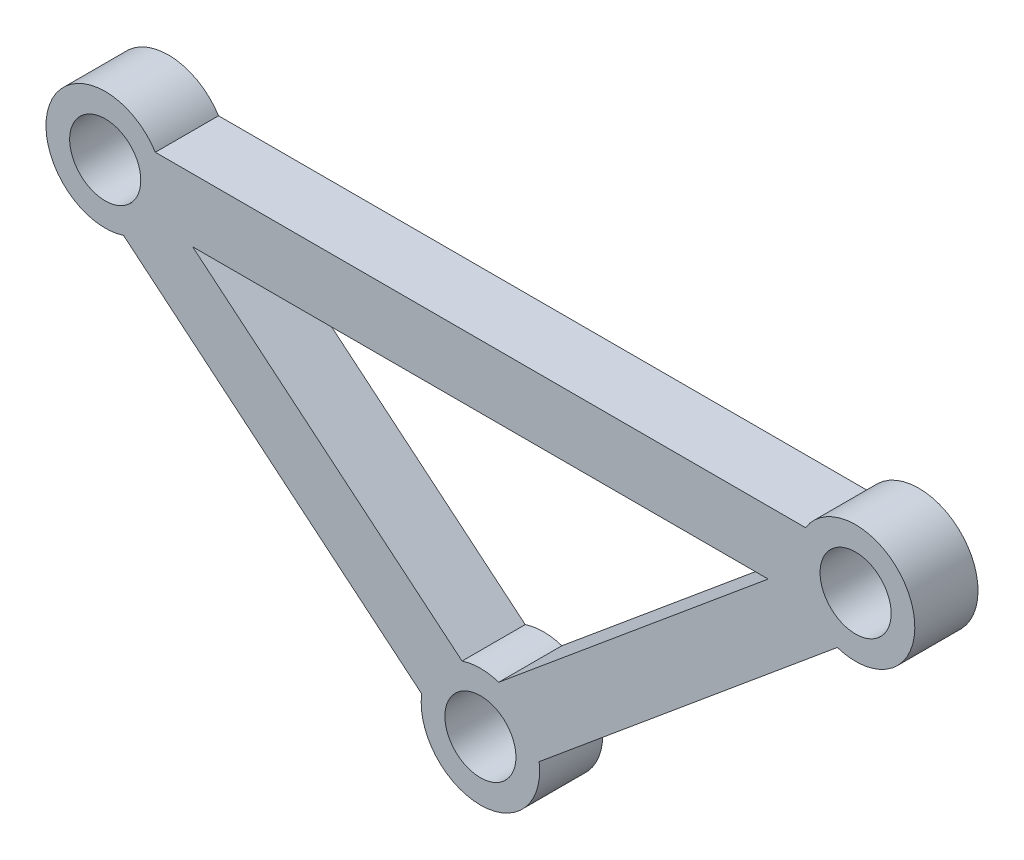
ISO-10303-21;
HEADER;
FILE_DESCRIPTION(('STEP AP214'),'2;1');
FILE_NAME('part.step','',(''),(''),'','','');
FILE_SCHEMA(('AUTOMOTIVE_DESIGN { 1 0 10303 214 1 1 1 1 }'));
ENDSEC;
DATA;
#1=APPLICATION_CONTEXT('core data for automotive mechanical design processes');
#2=APPLICATION_PROTOCOL_DEFINITION('international standard','automotive_design',2000,#1);
#3=PRODUCT_CONTEXT('',#1,'mechanical');
#4=PRODUCT('Part','Part','',(#3));
#5=PRODUCT_RELATED_PRODUCT_CATEGORY('part','',(#4));
#6=PRODUCT_DEFINITION_FORMATION('','',#4);
#7=PRODUCT_DEFINITION_CONTEXT('part definition',#1,'design');
#8=PRODUCT_DEFINITION('design','',#6,#7);
#9=PRODUCT_DEFINITION_SHAPE('','',#8);
#10=(LENGTH_UNIT() NAMED_UNIT(*) SI_UNIT(.MILLI.,.METRE.));
#11=(NAMED_UNIT(*) PLANE_ANGLE_UNIT() SI_UNIT($,.RADIAN.));
#12=(NAMED_UNIT(*) SI_UNIT($,.STERADIAN.) SOLID_ANGLE_UNIT());
#13=UNCERTAINTY_MEASURE_WITH_UNIT(LENGTH_MEASURE(1.E-05),#10,'distance_accuracy_value','');
#14=(GEOMETRIC_REPRESENTATION_CONTEXT(3) GLOBAL_UNCERTAINTY_ASSIGNED_CONTEXT((#13)) GLOBAL_UNIT_ASSIGNED_CONTEXT((#10,
#11,#12)) REPRESENTATION_CONTEXT('',''));
#15=CARTESIAN_POINT('',(0.,0.,0.));
#16=DIRECTION('',(0.,0.,1.));
#17=DIRECTION('',(1.,0.,0.));
#18=AXIS2_PLACEMENT_3D('',#15,#16,#17);
#19=CARTESIAN_POINT('',(-10.5388716402923,-12.6746268668175,8.));
#20=DIRECTION('',(0.639349193515692,0.768916516112662,0.));
#21=DIRECTION('',(-0.768916516112662,0.639349193515692,0.));
#22=AXIS2_PLACEMENT_3D('',#19,#20,#21);
#23=PLANE('',#22);
#24=DIRECTION('',(0.768916516112662,-0.639349193515692,0.));
#25=VECTOR('',#24,1.);
#26=CARTESIAN_POINT('',(-10.5388716402923,-12.6746268668175,0.));
#27=LINE('',#26,#25);
#28=CARTESIAN_POINT('',(-45.1791683499302,16.1285595654613,0.));
#29=VERTEX_POINT('',#28);
#30=CARTESIAN_POINT('',(-7.43514281959773,-15.2553576442426,0.));
#31=VERTEX_POINT('',#30);
#32=EDGE_CURVE('E166',#29,#31,#27,.T.);
#33=ORIENTED_EDGE('',*,*,#32,.T.);
#34=DIRECTION('',(0.,0.,-1.));
#35=VECTOR('',#34,1.);
#36=CARTESIAN_POINT('',(-7.43514281959773,-15.2553576442426,8.));
#37=LINE('',#36,#35);
#38=CARTESIAN_POINT('',(-7.43514281959773,-15.2553576442426,8.));
#39=VERTEX_POINT('',#38);
#40=EDGE_CURVE('E11',#39,#31,#37,.T.);
#41=ORIENTED_EDGE('',*,*,#40,.F.);
#42=DIRECTION('',(0.768916516112662,-0.639349193515692,0.));
#43=VECTOR('',#42,1.);
#44=CARTESIAN_POINT('',(-10.5388716402923,-12.6746268668175,8.));
#45=LINE('',#44,#43);
#46=CARTESIAN_POINT('',(-45.1791683499302,16.1285595654613,8.));
#47=VERTEX_POINT('',#46);
#48=EDGE_CURVE('E224',#47,#39,#45,.T.);
#49=ORIENTED_EDGE('',*,*,#48,.F.);
#50=DIRECTION('',(0.,0.,-1.));
#51=VECTOR('',#50,1.);
#52=CARTESIAN_POINT('',(-45.1791683499302,16.1285595654613,8.));
#53=LINE('',#52,#51);
#54=EDGE_CURVE('E179',#47,#29,#53,.T.);
#55=ORIENTED_EDGE('',*,*,#54,.T.);
#56=EDGE_LOOP('',(#33,#41,#49,#55));
#57=FACE_BOUND('',#56,.T.);
#58=ADVANCED_FACE('F36',(#57),#23,.F.);
#59=CARTESIAN_POINT('',(0.,-16.2395584632751,8.));
#60=DIRECTION('',(0.,0.,-1.));
#61=DIRECTION('',(-1.,0.,0.));
#62=AXIS2_PLACEMENT_3D('',#59,#60,#61);
#63=CYLINDRICAL_SURFACE('',#62,7.5);
#64=CARTESIAN_POINT('',(0.,-16.2395584632751,0.));
#65=DIRECTION('',(0.,0.,1.));
#66=DIRECTION('',(1.,0.,0.));
#67=AXIS2_PLACEMENT_3D('',#64,#65,#66);
#68=CIRCLE('',#67,7.5);
#69=CARTESIAN_POINT('',(7.43557573010436,-15.2586336130022,0.));
#70=VERTEX_POINT('',#69);
#71=EDGE_CURVE('E169',#31,#70,#68,.T.);
#72=ORIENTED_EDGE('',*,*,#71,.T.);
#73=DIRECTION('',(0.,0.,-1.));
#74=VECTOR('',#73,1.);
#75=CARTESIAN_POINT('',(7.43557573010436,-15.2586336130022,8.));
#76=LINE('',#75,#74);
#77=CARTESIAN_POINT('',(7.43557573010436,-15.2586336130022,8.));
#78=VERTEX_POINT('',#77);
#79=EDGE_CURVE('E46',#78,#70,#76,.T.);
#80=ORIENTED_EDGE('',*,*,#79,.F.);
#81=CARTESIAN_POINT('',(0.,-16.2395584632751,8.));
#82=DIRECTION('',(0.,0.,1.));
#83=DIRECTION('',(1.,0.,0.));
#84=AXIS2_PLACEMENT_3D('',#81,#82,#83);
#85=CIRCLE('',#84,7.5);
#86=EDGE_CURVE('E226',#39,#78,#85,.T.);
#87=ORIENTED_EDGE('',*,*,#86,.F.);
#88=ORIENTED_EDGE('',*,*,#40,.T.);
#89=EDGE_LOOP('',(#72,#80,#87,#88));
#90=FACE_BOUND('',#89,.T.);
#91=ADVANCED_FACE('F249',(#90),#63,.T.);
#92=CARTESIAN_POINT('',(10.5411681774638,-12.6760883146717,8.));
#93=DIRECTION('',(0.639387972132239,-0.768884270285603,0.));
#94=DIRECTION('',(0.768884270285603,0.639387972132239,0.));
#95=AXIS2_PLACEMENT_3D('',#92,#93,#94);
#96=PLANE('',#95);
#97=DIRECTION('',(-0.768884270285603,-0.639387972132239,0.));
#98=VECTOR('',#97,1.);
#99=CARTESIAN_POINT('',(10.5411681774638,-12.6760883146717,0.));
#100=LINE('',#99,#98);
#101=CARTESIAN_POINT('',(45.1795280469535,16.1284425241672,0.));
#102=VERTEX_POINT('',#101);
#103=EDGE_CURVE('E172',#102,#70,#100,.T.);
#104=ORIENTED_EDGE('',*,*,#103,.F.);
#105=DIRECTION('',(0.,0.,-1.));
#106=VECTOR('',#105,1.);
#107=CARTESIAN_POINT('',(45.1795280469535,16.1284425241672,8.));
#108=LINE('',#107,#106);
#109=CARTESIAN_POINT('',(45.1795280469535,16.1284425241672,8.));
#110=VERTEX_POINT('',#109);
#111=EDGE_CURVE('E139',#110,#102,#108,.T.);
#112=ORIENTED_EDGE('',*,*,#111,.F.);
#113=DIRECTION('',(-0.768884270285603,-0.639387972132239,0.));
#114=VECTOR('',#113,1.);
#115=CARTESIAN_POINT('',(10.5411681774638,-12.6760883146717,8.));
#116=LINE('',#115,#114);
#117=EDGE_CURVE('E132',#110,#78,#116,.T.);
#118=ORIENTED_EDGE('',*,*,#117,.T.);
#119=ORIENTED_EDGE('',*,*,#79,.T.);
#120=EDGE_LOOP('',(#104,#112,#118,#119));
#121=FACE_BOUND('',#120,.T.);
#122=ADVANCED_FACE('F229',(#121),#96,.T.);
#123=CARTESIAN_POINT('',(47.5,23.2604415367249,8.));
#124=DIRECTION('',(0.,0.,-1.));
#125=DIRECTION('',(-1.,0.,0.));
#126=AXIS2_PLACEMENT_3D('',#123,#124,#125);
#127=CYLINDRICAL_SURFACE('',#126,7.5);
#128=CARTESIAN_POINT('',(47.5,23.2604415367249,0.));
#129=DIRECTION('',(0.,0.,1.));
#130=DIRECTION('',(1.,0.,0.));
#131=AXIS2_PLACEMENT_3D('',#128,#129,#130);
#132=CIRCLE('',#131,7.5);
#133=CARTESIAN_POINT('',(41.1557112297752,27.2604415367249,0.));
#134=VERTEX_POINT('',#133);
#135=EDGE_CURVE('E138',#102,#134,#132,.T.);
#136=ORIENTED_EDGE('',*,*,#135,.T.);
#137=DIRECTION('',(0.,0.,-1.));
#138=VECTOR('',#137,1.);
#139=CARTESIAN_POINT('',(41.1557112297752,27.2604415367249,8.));
#140=LINE('',#139,#138);
#141=CARTESIAN_POINT('',(41.1557112297752,27.2604415367249,8.));
#142=VERTEX_POINT('',#141);
#143=EDGE_CURVE('E135',#142,#134,#140,.T.);
#144=ORIENTED_EDGE('',*,*,#143,.F.);
#145=CARTESIAN_POINT('',(47.5,23.2604415367249,8.));
#146=DIRECTION('',(0.,0.,1.));
#147=DIRECTION('',(1.,0.,0.));
#148=AXIS2_PLACEMENT_3D('',#145,#146,#147);
#149=CIRCLE('',#148,7.5);
#150=EDGE_CURVE('E126',#110,#142,#149,.T.);
#151=ORIENTED_EDGE('',*,*,#150,.F.);
#152=ORIENTED_EDGE('',*,*,#111,.T.);
#153=EDGE_LOOP('',(#136,#144,#151,#152));
#154=FACE_BOUND('',#153,.T.);
#155=ADVANCED_FACE('F136',(#154),#127,.T.);
#156=CARTESIAN_POINT('',(0.,27.2604415367249,8.));
#157=DIRECTION('',(0.,-1.,0.));
#158=DIRECTION('',(1.,0.,0.));
#159=AXIS2_PLACEMENT_3D('',#156,#157,#158);
#160=PLANE('',#159);
#161=DIRECTION('',(-1.,0.,0.));
#162=VECTOR('',#161,1.);
#163=CARTESIAN_POINT('',(0.,27.2604415367249,0.));
#164=LINE('',#163,#162);
#165=CARTESIAN_POINT('',(-41.1557112297752,27.2604415367249,0.));
#166=VERTEX_POINT('',#165);
#167=EDGE_CURVE('E90',#134,#166,#164,.T.);
#168=ORIENTED_EDGE('',*,*,#167,.T.);
#169=DIRECTION('',(0.,0.,-1.));
#170=VECTOR('',#169,1.);
#171=CARTESIAN_POINT('',(-41.1557112297752,27.2604415367249,8.));
#172=LINE('',#171,#170);
#173=CARTESIAN_POINT('',(-41.1557112297752,27.2604415367249,8.));
#174=VERTEX_POINT('',#173);
#175=EDGE_CURVE('E140',#174,#166,#172,.T.);
#176=ORIENTED_EDGE('',*,*,#175,.F.);
#177=DIRECTION('',(-1.,0.,0.));
#178=VECTOR('',#177,1.);
#179=CARTESIAN_POINT('',(0.,27.2604415367249,8.));
#180=LINE('',#179,#178);
#181=EDGE_CURVE('E130',#142,#174,#180,.T.);
#182=ORIENTED_EDGE('',*,*,#181,.F.);
#183=ORIENTED_EDGE('',*,*,#143,.T.);
#184=EDGE_LOOP('',(#168,#176,#182,#183));
#185=FACE_BOUND('',#184,.T.);
#186=ADVANCED_FACE('F142',(#185),#160,.F.);
#187=CARTESIAN_POINT('',(5.42606440040593,-6.52501415238686,8.));
#188=DIRECTION('',(0.639387972132239,-0.768884270285602,0.));
#189=DIRECTION('',(0.768884270285602,0.639387972132239,0.));
#190=AXIS2_PLACEMENT_3D('',#187,#188,#189);
#191=PLANE('',#190);
#192=DIRECTION('',(-0.768884270285602,-0.639387972132239,0.));
#193=VECTOR('',#192,1.);
#194=CARTESIAN_POINT('',(5.42606440040593,-6.52501415238686,0.));
#195=LINE('',#194,#193);
#196=CARTESIAN_POINT('',(36.4338908619959,19.2604415367249,0.));
#197=VERTEX_POINT('',#196);
#198=CARTESIAN_POINT('',(2.32047195304646,-9.10755945071737,0.));
#199=VERTEX_POINT('',#198);
#200=EDGE_CURVE('E148',#197,#199,#195,.T.);
#201=ORIENTED_EDGE('',*,*,#200,.T.);
#202=DIRECTION('',(0.,0.,-1.));
#203=VECTOR('',#202,1.);
#204=CARTESIAN_POINT('',(2.32047195304646,-9.10755945071737,8.));
#205=LINE('',#204,#203);
#206=CARTESIAN_POINT('',(2.32047195304646,-9.10755945071737,8.));
#207=VERTEX_POINT('',#206);
#208=EDGE_CURVE('E40',#207,#199,#205,.T.);
#209=ORIENTED_EDGE('',*,*,#208,.F.);
#210=DIRECTION('',(-0.768884270285602,-0.639387972132239,0.));
#211=VECTOR('',#210,1.);
#212=CARTESIAN_POINT('',(5.42606440040593,-6.52501415238686,8.));
#213=LINE('',#212,#211);
#214=CARTESIAN_POINT('',(36.4338908619959,19.2604415367249,8.));
#215=VERTEX_POINT('',#214);
#216=EDGE_CURVE('E178',#215,#207,#213,.T.);
#217=ORIENTED_EDGE('',*,*,#216,.F.);
#218=DIRECTION('',(0.,0.,-1.));
#219=VECTOR('',#218,1.);
#220=CARTESIAN_POINT('',(36.4338908619959,19.2604415367249,8.));
#221=LINE('',#220,#219);
#222=EDGE_CURVE('E144',#215,#197,#221,.T.);
#223=ORIENTED_EDGE('',*,*,#222,.T.);
#224=EDGE_LOOP('',(#201,#209,#217,#223));
#225=FACE_BOUND('',#224,.T.);
#226=ADVANCED_FACE('F38',(#225),#191,.F.);
#227=CARTESIAN_POINT('',(0.,-16.2395584632751,8.));
#228=DIRECTION('',(0.,0.,-1.));
#229=DIRECTION('',(-1.,0.,0.));
#230=AXIS2_PLACEMENT_3D('',#227,#228,#229);
#231=CYLINDRICAL_SURFACE('',#230,7.5);
#232=CARTESIAN_POINT('',(0.,-16.2395584632751,0.));
#233=DIRECTION('',(0.,0.,1.));
#234=DIRECTION('',(1.,0.,0.));
#235=AXIS2_PLACEMENT_3D('',#232,#233,#234);
#236=CIRCLE('',#235,7.5);
#237=CARTESIAN_POINT('',(-2.32363015236779,-9.10858777794712,0.));
#238=VERTEX_POINT('',#237);
#239=EDGE_CURVE('E151',#199,#238,#236,.T.);
#240=ORIENTED_EDGE('',*,*,#239,.T.);
#241=DIRECTION('',(0.,0.,-1.));
#242=VECTOR('',#241,1.);
#243=CARTESIAN_POINT('',(-2.32363015236779,-9.10858777794712,8.));
#244=LINE('',#243,#242);
#245=CARTESIAN_POINT('',(-2.32363015236779,-9.10858777794712,8.));
#246=VERTEX_POINT('',#245);
#247=EDGE_CURVE('E188',#246,#238,#244,.T.);
#248=ORIENTED_EDGE('',*,*,#247,.F.);
#249=CARTESIAN_POINT('',(0.,-16.2395584632751,8.));
#250=DIRECTION('',(0.,0.,1.));
#251=DIRECTION('',(1.,0.,0.));
#252=AXIS2_PLACEMENT_3D('',#249,#250,#251);
#253=CIRCLE('',#252,7.5);
#254=EDGE_CURVE('E105',#207,#246,#253,.T.);
#255=ORIENTED_EDGE('',*,*,#254,.F.);
#256=ORIENTED_EDGE('',*,*,#208,.T.);
#257=EDGE_LOOP('',(#240,#248,#255,#256));
#258=FACE_BOUND('',#257,.T.);
#259=ADVANCED_FACE('F194',(#258),#231,.T.);
#260=CARTESIAN_POINT('',(-5.42806106627412,-6.52674217737789,8.));
#261=DIRECTION('',(-0.639426948037325,-0.768851857072396,0.));
#262=DIRECTION('',(0.768851857072396,-0.639426948037325,0.));
#263=AXIS2_PLACEMENT_3D('',#260,#261,#262);
#264=PLANE('',#263);
#265=DIRECTION('',(-0.768851857072396,0.639426948037325,0.));
#266=VECTOR('',#265,1.);
#267=CARTESIAN_POINT('',(-5.42806106627412,-6.52674217737789,0.));
#268=LINE('',#267,#266);
#269=CARTESIAN_POINT('',(-36.4347681625437,19.2604415367249,0.));
#270=VERTEX_POINT('',#269);
#271=EDGE_CURVE('E153',#238,#270,#268,.T.);
#272=ORIENTED_EDGE('',*,*,#271,.T.);
#273=DIRECTION('',(0.,0.,-1.));
#274=VECTOR('',#273,1.);
#275=CARTESIAN_POINT('',(-36.4347681625437,19.2604415367249,8.));
#276=LINE('',#275,#274);
#277=CARTESIAN_POINT('',(-36.4347681625437,19.2604415367249,8.));
#278=VERTEX_POINT('',#277);
#279=EDGE_CURVE('E186',#278,#270,#276,.T.);
#280=ORIENTED_EDGE('',*,*,#279,.F.);
#281=DIRECTION('',(-0.768851857072396,0.639426948037325,0.));
#282=VECTOR('',#281,1.);
#283=CARTESIAN_POINT('',(-5.42806106627412,-6.52674217737789,8.));
#284=LINE('',#283,#282);
#285=EDGE_CURVE('E211',#246,#278,#284,.T.);
#286=ORIENTED_EDGE('',*,*,#285,.F.);
#287=ORIENTED_EDGE('',*,*,#247,.T.);
#288=EDGE_LOOP('',(#272,#280,#286,#287));
#289=FACE_BOUND('',#288,.T.);
#290=ADVANCED_FACE('F204',(#289),#264,.F.);
#291=CARTESIAN_POINT('',(0.,-16.2395584632751,8.));
#292=DIRECTION('',(0.,0.,-1.));
#293=DIRECTION('',(-1.,0.,0.));
#294=AXIS2_PLACEMENT_3D('',#291,#292,#293);
#295=CYLINDRICAL_SURFACE('',#294,4.5);
#296=CARTESIAN_POINT('',(0.,-16.2395584632751,8.));
#297=DIRECTION('',(0.,0.,1.));
#298=DIRECTION('',(1.,0.,0.));
#299=AXIS2_PLACEMENT_3D('',#296,#297,#298);
#300=CIRCLE('',#299,4.5);
#301=CARTESIAN_POINT('',(4.5,-16.2395584632751,8.));
#302=VERTEX_POINT('',#301);
#303=EDGE_CURVE('E221',#302,#302,#300,.T.);
#304=ORIENTED_EDGE('',*,*,#303,.T.);
#305=EDGE_LOOP('',(#304));
#306=FACE_BOUND('',#305,.T.);
#307=CARTESIAN_POINT('',(0.,-16.2395584632751,0.));
#308=DIRECTION('',(0.,0.,1.));
#309=DIRECTION('',(1.,0.,0.));
#310=AXIS2_PLACEMENT_3D('',#307,#308,#309);
#311=CIRCLE('',#310,4.5);
#312=CARTESIAN_POINT('',(4.5,-16.2395584632751,0.));
#313=VERTEX_POINT('',#312);
#314=EDGE_CURVE('E163',#313,#313,#311,.T.);
#315=ORIENTED_EDGE('',*,*,#314,.F.);
#316=EDGE_LOOP('',(#315));
#317=FACE_BOUND('',#316,.T.);
#318=ADVANCED_FACE('F258',(#306,#317),#295,.F.);
#319=CARTESIAN_POINT('',(47.5,23.2604415367249,8.));
#320=DIRECTION('',(0.,0.,-1.));
#321=DIRECTION('',(-1.,0.,0.));
#322=AXIS2_PLACEMENT_3D('',#319,#320,#321);
#323=CYLINDRICAL_SURFACE('',#322,4.5);
#324=CARTESIAN_POINT('',(47.5,23.2604415367249,8.));
#325=DIRECTION('',(0.,0.,1.));
#326=DIRECTION('',(1.,0.,0.));
#327=AXIS2_PLACEMENT_3D('',#324,#325,#326);
#328=CIRCLE('',#327,4.5);
#329=CARTESIAN_POINT('',(52.,23.2604415367249,8.));
#330=VERTEX_POINT('',#329);
#331=EDGE_CURVE('E214',#330,#330,#328,.T.);
#332=ORIENTED_EDGE('',*,*,#331,.T.);
#333=EDGE_LOOP('',(#332));
#334=FACE_BOUND('',#333,.T.);
#335=CARTESIAN_POINT('',(47.5,23.2604415367249,0.));
#336=DIRECTION('',(0.,0.,1.));
#337=DIRECTION('',(1.,0.,0.));
#338=AXIS2_PLACEMENT_3D('',#335,#336,#337);
#339=CIRCLE('',#338,4.5);
#340=CARTESIAN_POINT('',(52.,23.2604415367249,0.));
#341=VERTEX_POINT('',#340);
#342=EDGE_CURVE('E160',#341,#341,#339,.T.);
#343=ORIENTED_EDGE('',*,*,#342,.F.);
#344=EDGE_LOOP('',(#343));
#345=FACE_BOUND('',#344,.T.);
#346=ADVANCED_FACE('F261',(#334,#345),#323,.F.);
#347=CARTESIAN_POINT('',(-47.5,23.2604415367249,8.));
#348=DIRECTION('',(0.,0.,-1.));
#349=DIRECTION('',(-1.,0.,0.));
#350=AXIS2_PLACEMENT_3D('',#347,#348,#349);
#351=CYLINDRICAL_SURFACE('',#350,4.5);
#352=CARTESIAN_POINT('',(-47.5,23.2604415367249,8.));
#353=DIRECTION('',(0.,0.,1.));
#354=DIRECTION('',(1.,0.,0.));
#355=AXIS2_PLACEMENT_3D('',#352,#353,#354);
#356=CIRCLE('',#355,4.5);
#357=CARTESIAN_POINT('',(-43.,23.2604415367249,8.));
#358=VERTEX_POINT('',#357);
#359=EDGE_CURVE('E210',#358,#358,#356,.T.);
#360=ORIENTED_EDGE('',*,*,#359,.T.);
#361=EDGE_LOOP('',(#360));
#362=FACE_BOUND('',#361,.T.);
#363=CARTESIAN_POINT('',(-47.5,23.2604415367249,0.));
#364=DIRECTION('',(0.,0.,1.));
#365=DIRECTION('',(1.,0.,0.));
#366=AXIS2_PLACEMENT_3D('',#363,#364,#365);
#367=CIRCLE('',#366,4.5);
#368=CARTESIAN_POINT('',(-43.,23.2604415367249,0.));
#369=VERTEX_POINT('',#368);
#370=EDGE_CURVE('E157',#369,#369,#367,.T.);
#371=ORIENTED_EDGE('',*,*,#370,.F.);
#372=EDGE_LOOP('',(#371));
#373=FACE_BOUND('',#372,.T.);
#374=ADVANCED_FACE('F244',(#362,#373),#351,.F.);
#375=CARTESIAN_POINT('',(0.,19.2604415367249,8.));
#376=DIRECTION('',(0.,1.,0.));
#377=DIRECTION('',(-1.,0.,0.));
#378=AXIS2_PLACEMENT_3D('',#375,#376,#377);
#379=PLANE('',#378);
#380=DIRECTION('',(1.,0.,0.));
#381=VECTOR('',#380,1.);
#382=CARTESIAN_POINT('',(0.,19.2604415367249,0.));
#383=LINE('',#382,#381);
#384=EDGE_CURVE('E155',#270,#197,#383,.T.);
#385=ORIENTED_EDGE('',*,*,#384,.T.);
#386=ORIENTED_EDGE('',*,*,#222,.F.);
#387=DIRECTION('',(1.,0.,0.));
#388=VECTOR('',#387,1.);
#389=CARTESIAN_POINT('',(0.,19.2604415367249,8.));
#390=LINE('',#389,#388);
#391=EDGE_CURVE('E208',#278,#215,#390,.T.);
#392=ORIENTED_EDGE('',*,*,#391,.F.);
#393=ORIENTED_EDGE('',*,*,#279,.T.);
#394=EDGE_LOOP('',(#385,#386,#392,#393));
#395=FACE_BOUND('',#394,.T.);
#396=ADVANCED_FACE('F207',(#395),#379,.F.);
#397=CARTESIAN_POINT('',(-47.5,23.2604415367249,8.));
#398=DIRECTION('',(0.,0.,-1.));
#399=DIRECTION('',(-1.,0.,0.));
#400=AXIS2_PLACEMENT_3D('',#397,#398,#399);
#401=CYLINDRICAL_SURFACE('',#400,7.5);
#402=CARTESIAN_POINT('',(-47.5,23.2604415367249,0.));
#403=DIRECTION('',(0.,0.,1.));
#404=DIRECTION('',(1.,0.,0.));
#405=AXIS2_PLACEMENT_3D('',#402,#403,#404);
#406=CIRCLE('',#405,7.5);
#407=EDGE_CURVE('E96',#166,#29,#406,.T.);
#408=ORIENTED_EDGE('',*,*,#407,.T.);
#409=ORIENTED_EDGE('',*,*,#54,.F.);
#410=CARTESIAN_POINT('',(-47.5,23.2604415367249,8.));
#411=DIRECTION('',(0.,0.,1.));
#412=DIRECTION('',(1.,0.,0.));
#413=AXIS2_PLACEMENT_3D('',#410,#411,#412);
#414=CIRCLE('',#413,7.5);
#415=EDGE_CURVE('E55',#174,#47,#414,.T.);
#416=ORIENTED_EDGE('',*,*,#415,.F.);
#417=ORIENTED_EDGE('',*,*,#175,.T.);
#418=EDGE_LOOP('',(#408,#409,#416,#417));
#419=FACE_BOUND('',#418,.T.);
#420=ADVANCED_FACE('F236',(#419),#401,.T.);
#421=CARTESIAN_POINT('',(0.,0.,8.));
#422=DIRECTION('',(0.,0.,1.));
#423=DIRECTION('',(1.,0.,0.));
#424=AXIS2_PLACEMENT_3D('',#421,#422,#423);
#425=PLANE('',#424);
#426=ORIENTED_EDGE('',*,*,#216,.T.);
#427=ORIENTED_EDGE('',*,*,#254,.T.);
#428=ORIENTED_EDGE('',*,*,#285,.T.);
#429=ORIENTED_EDGE('',*,*,#391,.T.);
#430=EDGE_LOOP('',(#426,#427,#428,#429));
#431=FACE_BOUND('',#430,.T.);
#432=ORIENTED_EDGE('',*,*,#359,.F.);
#433=EDGE_LOOP('',(#432));
#434=FACE_BOUND('',#433,.T.);
#435=ORIENTED_EDGE('',*,*,#331,.F.);
#436=EDGE_LOOP('',(#435));
#437=FACE_BOUND('',#436,.T.);
#438=ORIENTED_EDGE('',*,*,#303,.F.);
#439=EDGE_LOOP('',(#438));
#440=FACE_BOUND('',#439,.T.);
#441=ORIENTED_EDGE('',*,*,#48,.T.);
#442=ORIENTED_EDGE('',*,*,#86,.T.);
#443=ORIENTED_EDGE('',*,*,#117,.F.);
#444=ORIENTED_EDGE('',*,*,#150,.T.);
#445=ORIENTED_EDGE('',*,*,#181,.T.);
#446=ORIENTED_EDGE('',*,*,#415,.T.);
#447=EDGE_LOOP('',(#441,#442,#443,#444,#445,#446));
#448=FACE_BOUND('',#447,.T.);
#449=ADVANCED_FACE('F128',(#431,#434,#437,#440,#448),#425,.T.);
#450=CARTESIAN_POINT('',(0.,0.,0.));
#451=DIRECTION('',(0.,0.,1.));
#452=DIRECTION('',(1.,0.,0.));
#453=AXIS2_PLACEMENT_3D('',#450,#451,#452);
#454=PLANE('',#453);
#455=ORIENTED_EDGE('',*,*,#200,.F.);
#456=ORIENTED_EDGE('',*,*,#384,.F.);
#457=ORIENTED_EDGE('',*,*,#271,.F.);
#458=ORIENTED_EDGE('',*,*,#239,.F.);
#459=EDGE_LOOP('',(#455,#456,#457,#458));
#460=FACE_BOUND('',#459,.T.);
#461=ORIENTED_EDGE('',*,*,#370,.T.);
#462=EDGE_LOOP('',(#461));
#463=FACE_BOUND('',#462,.T.);
#464=ORIENTED_EDGE('',*,*,#342,.T.);
#465=EDGE_LOOP('',(#464));
#466=FACE_BOUND('',#465,.T.);
#467=ORIENTED_EDGE('',*,*,#314,.T.);
#468=EDGE_LOOP('',(#467));
#469=FACE_BOUND('',#468,.T.);
#470=ORIENTED_EDGE('',*,*,#32,.F.);
#471=ORIENTED_EDGE('',*,*,#407,.F.);
#472=ORIENTED_EDGE('',*,*,#167,.F.);
#473=ORIENTED_EDGE('',*,*,#135,.F.);
#474=ORIENTED_EDGE('',*,*,#103,.T.);
#475=ORIENTED_EDGE('',*,*,#71,.F.);
#476=EDGE_LOOP('',(#470,#471,#472,#473,#474,#475));
#477=FACE_BOUND('',#476,.T.);
#478=ADVANCED_FACE('F201',(#460,#463,#466,#469,#477),#454,.F.);
#479=CLOSED_SHELL('',(#58,#91,#122,#155,#186,#226,#259,#290,#318,#346,#374,#396,#420,#449,#478));
#480=MANIFOLD_SOLID_BREP('B2',#479);
#481=ADVANCED_BREP_SHAPE_REPRESENTATION('',(#18,#480),#14);
#482=SHAPE_DEFINITION_REPRESENTATION(#9,#481);
ENDSEC;
END-ISO-10303-21;
